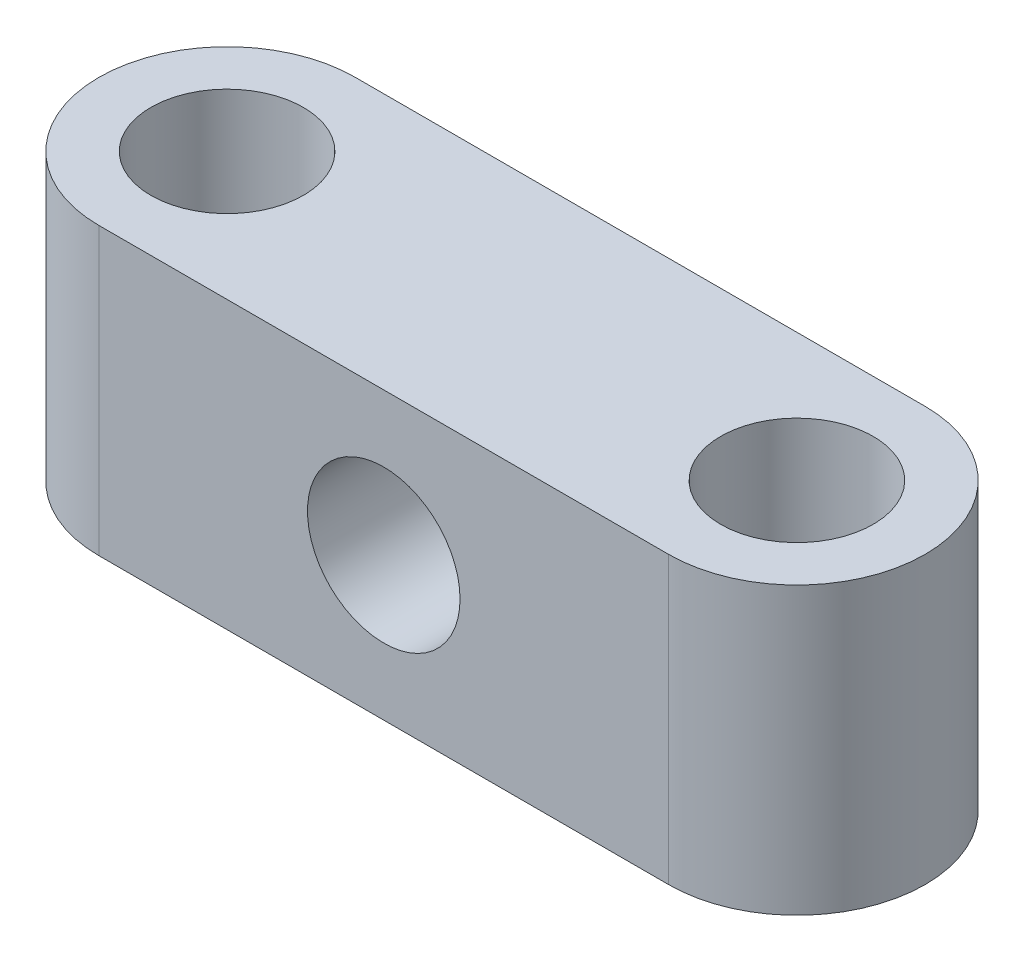
ISO-10303-21;
HEADER;
FILE_DESCRIPTION(('STEP AP214'),'2;1');
FILE_NAME('part.step','',(''),(''),'','','');
FILE_SCHEMA(('AUTOMOTIVE_DESIGN { 1 0 10303 214 1 1 1 1 }'));
ENDSEC;
DATA;
#1=APPLICATION_CONTEXT('core data for automotive mechanical design processes');
#2=APPLICATION_PROTOCOL_DEFINITION('international standard','automotive_design',2000,#1);
#3=PRODUCT_CONTEXT('',#1,'mechanical');
#4=PRODUCT('Part','Part','',(#3));
#5=PRODUCT_RELATED_PRODUCT_CATEGORY('part','',(#4));
#6=PRODUCT_DEFINITION_FORMATION('','',#4);
#7=PRODUCT_DEFINITION_CONTEXT('part definition',#1,'design');
#8=PRODUCT_DEFINITION('design','',#6,#7);
#9=PRODUCT_DEFINITION_SHAPE('','',#8);
#10=(LENGTH_UNIT() NAMED_UNIT(*) SI_UNIT(.MILLI.,.METRE.));
#11=(NAMED_UNIT(*) PLANE_ANGLE_UNIT() SI_UNIT($,.RADIAN.));
#12=(NAMED_UNIT(*) SI_UNIT($,.STERADIAN.) SOLID_ANGLE_UNIT());
#13=UNCERTAINTY_MEASURE_WITH_UNIT(LENGTH_MEASURE(1.E-05),#10,'distance_accuracy_value','');
#14=(GEOMETRIC_REPRESENTATION_CONTEXT(3) GLOBAL_UNCERTAINTY_ASSIGNED_CONTEXT((#13)) GLOBAL_UNIT_ASSIGNED_CONTEXT((#10,
#11,#12)) REPRESENTATION_CONTEXT('',''));
#15=CARTESIAN_POINT('',(0.,0.,0.));
#16=DIRECTION('',(0.,0.,1.));
#17=DIRECTION('',(1.,0.,0.));
#18=AXIS2_PLACEMENT_3D('',#15,#16,#17);
#19=CARTESIAN_POINT('',(0.,9.,-12.4853389132924));
#20=DIRECTION('',(0.,0.,-1.));
#21=DIRECTION('',(-1.,0.,0.));
#22=AXIS2_PLACEMENT_3D('',#19,#20,#21);
#23=PLANE('',#22);
#24=CARTESIAN_POINT('',(-58.8563358786887,4.5,-12.4853389132924));
#25=DIRECTION('',(0.,0.,-1.));
#26=DIRECTION('',(-1.,0.,0.));
#27=AXIS2_PLACEMENT_3D('',#24,#25,#26);
#28=CIRCLE('',#27,2.4);
#29=CARTESIAN_POINT('',(-61.2563358786887,4.5,-12.4853389132924));
#30=VERTEX_POINT('',#29);
#31=EDGE_CURVE('E120',#30,#30,#28,.T.);
#32=ORIENTED_EDGE('',*,*,#31,.F.);
#33=EDGE_LOOP('',(#32));
#34=FACE_BOUND('',#33,.T.);
#35=DIRECTION('',(1.,0.,0.));
#36=VECTOR('',#35,1.);
#37=CARTESIAN_POINT('',(0.,0.,-12.4853389132924));
#38=LINE('',#37,#36);
#39=CARTESIAN_POINT('',(-67.8213358786887,0.,-12.4853389132924));
#40=VERTEX_POINT('',#39);
#41=CARTESIAN_POINT('',(-49.8913358786887,0.,-12.4853389132924));
#42=VERTEX_POINT('',#41);
#43=EDGE_CURVE('E112',#40,#42,#38,.T.);
#44=ORIENTED_EDGE('',*,*,#43,.F.);
#45=DIRECTION('',(0.,-1.,0.));
#46=VECTOR('',#45,1.);
#47=CARTESIAN_POINT('',(-67.8213358786887,9.,-12.4853389132924));
#48=LINE('',#47,#46);
#49=CARTESIAN_POINT('',(-67.8213358786887,9.,-12.4853389132924));
#50=VERTEX_POINT('',#49);
#51=EDGE_CURVE('E11',#50,#40,#48,.T.);
#52=ORIENTED_EDGE('',*,*,#51,.F.);
#53=DIRECTION('',(1.,0.,0.));
#54=VECTOR('',#53,1.);
#55=CARTESIAN_POINT('',(0.,9.,-12.4853389132924));
#56=LINE('',#55,#54);
#57=CARTESIAN_POINT('',(-49.8913358786887,9.,-12.4853389132924));
#58=VERTEX_POINT('',#57);
#59=EDGE_CURVE('E98',#50,#58,#56,.T.);
#60=ORIENTED_EDGE('',*,*,#59,.T.);
#61=DIRECTION('',(0.,-1.,0.));
#62=VECTOR('',#61,1.);
#63=CARTESIAN_POINT('',(-49.8913358786887,9.,-12.4853389132924));
#64=LINE('',#63,#62);
#65=EDGE_CURVE('E80',#58,#42,#64,.T.);
#66=ORIENTED_EDGE('',*,*,#65,.T.);
#67=EDGE_LOOP('',(#44,#52,#60,#66));
#68=FACE_BOUND('',#67,.T.);
#69=ADVANCED_FACE('F41',(#34,#68),#23,.T.);
#70=CARTESIAN_POINT('',(-67.8213358786887,9.,-8.45033891329243));
#71=DIRECTION('',(0.,-1.,0.));
#72=DIRECTION('',(0.,0.,-1.));
#73=AXIS2_PLACEMENT_3D('',#70,#71,#72);
#74=CYLINDRICAL_SURFACE('',#73,4.035);
#75=CARTESIAN_POINT('',(-67.8213358786887,0.,-8.45033891329243));
#76=DIRECTION('',(0.,1.,0.));
#77=DIRECTION('',(0.,0.,1.));
#78=AXIS2_PLACEMENT_3D('',#75,#76,#77);
#79=CIRCLE('',#78,4.035);
#80=CARTESIAN_POINT('',(-67.8213358786887,0.,-4.41533891329243));
#81=VERTEX_POINT('',#80);
#82=EDGE_CURVE('E103',#40,#81,#79,.T.);
#83=ORIENTED_EDGE('',*,*,#82,.T.);
#84=DIRECTION('',(0.,-1.,0.));
#85=VECTOR('',#84,1.);
#86=CARTESIAN_POINT('',(-67.8213358786887,9.,-4.41533891329243));
#87=LINE('',#86,#85);
#88=CARTESIAN_POINT('',(-67.8213358786887,9.,-4.41533891329243));
#89=VERTEX_POINT('',#88);
#90=EDGE_CURVE('E50',#89,#81,#87,.T.);
#91=ORIENTED_EDGE('',*,*,#90,.F.);
#92=CARTESIAN_POINT('',(-67.8213358786887,9.,-8.45033891329243));
#93=DIRECTION('',(0.,1.,0.));
#94=DIRECTION('',(0.,0.,1.));
#95=AXIS2_PLACEMENT_3D('',#92,#93,#94);
#96=CIRCLE('',#95,4.035);
#97=EDGE_CURVE('E95',#50,#89,#96,.T.);
#98=ORIENTED_EDGE('',*,*,#97,.F.);
#99=ORIENTED_EDGE('',*,*,#51,.T.);
#100=EDGE_LOOP('',(#83,#91,#98,#99));
#101=FACE_BOUND('',#100,.T.);
#102=ADVANCED_FACE('F101',(#101),#74,.T.);
#103=CARTESIAN_POINT('',(0.,9.,-4.41533891329243));
#104=DIRECTION('',(0.,0.,-1.));
#105=DIRECTION('',(-1.,0.,0.));
#106=AXIS2_PLACEMENT_3D('',#103,#104,#105);
#107=PLANE('',#106);
#108=CARTESIAN_POINT('',(-58.8563358786887,4.5,-4.41533891329243));
#109=DIRECTION('',(0.,0.,1.));
#110=DIRECTION('',(1.,0.,0.));
#111=AXIS2_PLACEMENT_3D('',#108,#109,#110);
#112=CIRCLE('',#111,2.4);
#113=CARTESIAN_POINT('',(-56.4563358786887,4.5,-4.41533891329243));
#114=VERTEX_POINT('',#113);
#115=EDGE_CURVE('E130',#114,#114,#112,.T.);
#116=ORIENTED_EDGE('',*,*,#115,.F.);
#117=EDGE_LOOP('',(#116));
#118=FACE_BOUND('',#117,.T.);
#119=DIRECTION('',(1.,0.,0.));
#120=VECTOR('',#119,1.);
#121=CARTESIAN_POINT('',(0.,0.,-4.41533891329243));
#122=LINE('',#121,#120);
#123=CARTESIAN_POINT('',(-49.8913358786887,0.,-4.41533891329243));
#124=VERTEX_POINT('',#123);
#125=EDGE_CURVE('E109',#81,#124,#122,.T.);
#126=ORIENTED_EDGE('',*,*,#125,.T.);
#127=DIRECTION('',(0.,-1.,0.));
#128=VECTOR('',#127,1.);
#129=CARTESIAN_POINT('',(-49.8913358786887,9.,-4.41533891329243));
#130=LINE('',#129,#128);
#131=CARTESIAN_POINT('',(-49.8913358786887,9.,-4.41533891329243));
#132=VERTEX_POINT('',#131);
#133=EDGE_CURVE('E94',#132,#124,#130,.T.);
#134=ORIENTED_EDGE('',*,*,#133,.F.);
#135=DIRECTION('',(1.,0.,0.));
#136=VECTOR('',#135,1.);
#137=CARTESIAN_POINT('',(0.,9.,-4.41533891329243));
#138=LINE('',#137,#136);
#139=EDGE_CURVE('E88',#89,#132,#138,.T.);
#140=ORIENTED_EDGE('',*,*,#139,.F.);
#141=ORIENTED_EDGE('',*,*,#90,.T.);
#142=EDGE_LOOP('',(#126,#134,#140,#141));
#143=FACE_BOUND('',#142,.T.);
#144=ADVANCED_FACE('F91',(#118,#143),#107,.F.);
#145=CARTESIAN_POINT('',(-67.8213358786887,9.,-8.45033891329243));
#146=DIRECTION('',(0.,-1.,0.));
#147=DIRECTION('',(0.,0.,-1.));
#148=AXIS2_PLACEMENT_3D('',#145,#146,#147);
#149=CYLINDRICAL_SURFACE('',#148,2.4);
#150=CARTESIAN_POINT('',(-67.8213358786887,9.,-8.45033891329243));
#151=DIRECTION('',(0.,1.,0.));
#152=DIRECTION('',(0.,0.,1.));
#153=AXIS2_PLACEMENT_3D('',#150,#151,#152);
#154=CIRCLE('',#153,2.4);
#155=CARTESIAN_POINT('',(-67.8213358786887,9.,-6.05033891329243));
#156=VERTEX_POINT('',#155);
#157=EDGE_CURVE('E123',#156,#156,#154,.T.);
#158=ORIENTED_EDGE('',*,*,#157,.T.);
#159=EDGE_LOOP('',(#158));
#160=FACE_BOUND('',#159,.T.);
#161=CARTESIAN_POINT('',(-67.8213358786887,0.,-8.45033891329243));
#162=DIRECTION('',(0.,1.,0.));
#163=DIRECTION('',(0.,0.,1.));
#164=AXIS2_PLACEMENT_3D('',#161,#162,#163);
#165=CIRCLE('',#164,2.4);
#166=CARTESIAN_POINT('',(-67.8213358786887,0.,-6.05033891329243));
#167=VERTEX_POINT('',#166);
#168=EDGE_CURVE('E114',#167,#167,#165,.T.);
#169=ORIENTED_EDGE('',*,*,#168,.F.);
#170=EDGE_LOOP('',(#169));
#171=FACE_BOUND('',#170,.T.);
#172=ADVANCED_FACE('F137',(#160,#171),#149,.F.);
#173=CARTESIAN_POINT('',(-49.8913358786887,9.,-8.45033891329243));
#174=DIRECTION('',(0.,-1.,0.));
#175=DIRECTION('',(0.,0.,-1.));
#176=AXIS2_PLACEMENT_3D('',#173,#174,#175);
#177=CYLINDRICAL_SURFACE('',#176,2.4);
#178=CARTESIAN_POINT('',(-49.8913358786887,9.,-8.45033891329243));
#179=DIRECTION('',(0.,1.,0.));
#180=DIRECTION('',(0.,0.,1.));
#181=AXIS2_PLACEMENT_3D('',#178,#179,#180);
#182=CIRCLE('',#181,2.4);
#183=CARTESIAN_POINT('',(-49.8913358786887,9.,-6.05033891329243));
#184=VERTEX_POINT('',#183);
#185=EDGE_CURVE('E108',#184,#184,#182,.T.);
#186=ORIENTED_EDGE('',*,*,#185,.T.);
#187=EDGE_LOOP('',(#186));
#188=FACE_BOUND('',#187,.T.);
#189=CARTESIAN_POINT('',(-49.8913358786887,0.,-8.45033891329243));
#190=DIRECTION('',(0.,1.,0.));
#191=DIRECTION('',(0.,0.,1.));
#192=AXIS2_PLACEMENT_3D('',#189,#190,#191);
#193=CIRCLE('',#192,2.4);
#194=CARTESIAN_POINT('',(-49.8913358786887,0.,-6.05033891329243));
#195=VERTEX_POINT('',#194);
#196=EDGE_CURVE('E117',#195,#195,#193,.T.);
#197=ORIENTED_EDGE('',*,*,#196,.F.);
#198=EDGE_LOOP('',(#197));
#199=FACE_BOUND('',#198,.T.);
#200=ADVANCED_FACE('F43',(#188,#199),#177,.F.);
#201=CARTESIAN_POINT('',(-49.8913358786887,9.,-8.45033891329243));
#202=DIRECTION('',(0.,-1.,0.));
#203=DIRECTION('',(0.,0.,-1.));
#204=AXIS2_PLACEMENT_3D('',#201,#202,#203);
#205=CYLINDRICAL_SURFACE('',#204,4.035);
#206=CARTESIAN_POINT('',(-49.8913358786887,0.,-8.45033891329243));
#207=DIRECTION('',(0.,1.,0.));
#208=DIRECTION('',(0.,0.,1.));
#209=AXIS2_PLACEMENT_3D('',#206,#207,#208);
#210=CIRCLE('',#209,4.035);
#211=EDGE_CURVE('E73',#124,#42,#210,.T.);
#212=ORIENTED_EDGE('',*,*,#211,.T.);
#213=ORIENTED_EDGE('',*,*,#65,.F.);
#214=CARTESIAN_POINT('',(-49.8913358786887,9.,-8.45033891329243));
#215=DIRECTION('',(0.,1.,0.));
#216=DIRECTION('',(0.,0.,1.));
#217=AXIS2_PLACEMENT_3D('',#214,#215,#216);
#218=CIRCLE('',#217,4.035);
#219=EDGE_CURVE('E58',#132,#58,#218,.T.);
#220=ORIENTED_EDGE('',*,*,#219,.F.);
#221=ORIENTED_EDGE('',*,*,#133,.T.);
#222=EDGE_LOOP('',(#212,#213,#220,#221));
#223=FACE_BOUND('',#222,.T.);
#224=ADVANCED_FACE('F162',(#223),#205,.T.);
#225=CARTESIAN_POINT('',(0.,9.,0.));
#226=DIRECTION('',(0.,1.,0.));
#227=DIRECTION('',(0.,0.,1.));
#228=AXIS2_PLACEMENT_3D('',#225,#226,#227);
#229=PLANE('',#228);
#230=ORIENTED_EDGE('',*,*,#185,.F.);
#231=EDGE_LOOP('',(#230));
#232=FACE_BOUND('',#231,.T.);
#233=ORIENTED_EDGE('',*,*,#157,.F.);
#234=EDGE_LOOP('',(#233));
#235=FACE_BOUND('',#234,.T.);
#236=ORIENTED_EDGE('',*,*,#59,.F.);
#237=ORIENTED_EDGE('',*,*,#97,.T.);
#238=ORIENTED_EDGE('',*,*,#139,.T.);
#239=ORIENTED_EDGE('',*,*,#219,.T.);
#240=EDGE_LOOP('',(#236,#237,#238,#239));
#241=FACE_BOUND('',#240,.T.);
#242=ADVANCED_FACE('F97',(#232,#235,#241),#229,.T.);
#243=CARTESIAN_POINT('',(0.,0.,0.));
#244=DIRECTION('',(0.,1.,0.));
#245=DIRECTION('',(0.,0.,1.));
#246=AXIS2_PLACEMENT_3D('',#243,#244,#245);
#247=PLANE('',#246);
#248=ORIENTED_EDGE('',*,*,#196,.T.);
#249=EDGE_LOOP('',(#248));
#250=FACE_BOUND('',#249,.T.);
#251=ORIENTED_EDGE('',*,*,#168,.T.);
#252=EDGE_LOOP('',(#251));
#253=FACE_BOUND('',#252,.T.);
#254=ORIENTED_EDGE('',*,*,#43,.T.);
#255=ORIENTED_EDGE('',*,*,#211,.F.);
#256=ORIENTED_EDGE('',*,*,#125,.F.);
#257=ORIENTED_EDGE('',*,*,#82,.F.);
#258=EDGE_LOOP('',(#254,#255,#256,#257));
#259=FACE_BOUND('',#258,.T.);
#260=ADVANCED_FACE('F154',(#250,#253,#259),#247,.F.);
#261=CARTESIAN_POINT('',(-58.8563358786887,4.5,-18.4153389132924));
#262=DIRECTION('',(0.,0.,1.));
#263=DIRECTION('',(1.,0.,0.));
#264=AXIS2_PLACEMENT_3D('',#261,#262,#263);
#265=CYLINDRICAL_SURFACE('',#264,2.4);
#266=ORIENTED_EDGE('',*,*,#31,.T.);
#267=EDGE_LOOP('',(#266));
#268=FACE_BOUND('',#267,.T.);
#269=ORIENTED_EDGE('',*,*,#115,.T.);
#270=EDGE_LOOP('',(#269));
#271=FACE_BOUND('',#270,.T.);
#272=ADVANCED_FACE('F134',(#268,#271),#265,.F.);
#273=CLOSED_SHELL('',(#69,#102,#144,#172,#200,#224,#242,#260,#272));
#274=MANIFOLD_SOLID_BREP('B2',#273);
#275=ADVANCED_BREP_SHAPE_REPRESENTATION('',(#18,#274),#14);
#276=SHAPE_DEFINITION_REPRESENTATION(#9,#275);
ENDSEC;
END-ISO-10303-21;
